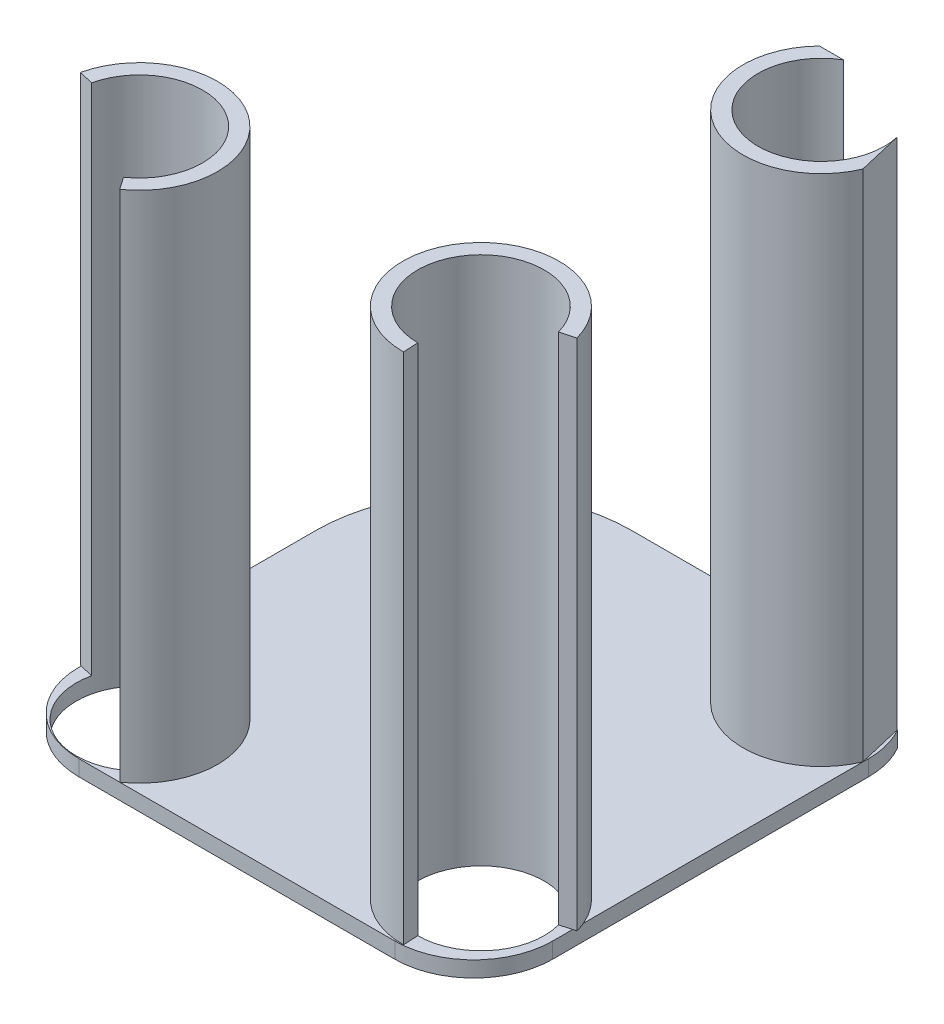
ISO-10303-21;
HEADER;
FILE_DESCRIPTION(('STEP AP214'),'2;1');
FILE_NAME('part.step','',(''),(''),'','','');
FILE_SCHEMA(('AUTOMOTIVE_DESIGN { 1 0 10303 214 1 1 1 1 }'));
ENDSEC;
DATA;
#1=APPLICATION_CONTEXT('core data for automotive mechanical design processes');
#2=APPLICATION_PROTOCOL_DEFINITION('international standard','automotive_design',2000,#1);
#3=PRODUCT_CONTEXT('',#1,'mechanical');
#4=PRODUCT('Part','Part','',(#3));
#5=PRODUCT_RELATED_PRODUCT_CATEGORY('part','',(#4));
#6=PRODUCT_DEFINITION_FORMATION('','',#4);
#7=PRODUCT_DEFINITION_CONTEXT('part definition',#1,'design');
#8=PRODUCT_DEFINITION('design','',#6,#7);
#9=PRODUCT_DEFINITION_SHAPE('','',#8);
#10=(LENGTH_UNIT() NAMED_UNIT(*) SI_UNIT(.MILLI.,.METRE.));
#11=(NAMED_UNIT(*) PLANE_ANGLE_UNIT() SI_UNIT($,.RADIAN.));
#12=(NAMED_UNIT(*) SI_UNIT($,.STERADIAN.) SOLID_ANGLE_UNIT());
#13=UNCERTAINTY_MEASURE_WITH_UNIT(LENGTH_MEASURE(1.E-05),#10,'distance_accuracy_value','');
#14=(GEOMETRIC_REPRESENTATION_CONTEXT(3) GLOBAL_UNCERTAINTY_ASSIGNED_CONTEXT((#13)) GLOBAL_UNIT_ASSIGNED_CONTEXT((#10,
#11,#12)) REPRESENTATION_CONTEXT('',''));
#15=CARTESIAN_POINT('',(0.,0.,0.));
#16=DIRECTION('',(0.,0.,1.));
#17=DIRECTION('',(1.,0.,0.));
#18=AXIS2_PLACEMENT_3D('',#15,#16,#17);
#19=CARTESIAN_POINT('',(-10.,2.,-10.));
#20=DIRECTION('',(0.,1.,0.));
#21=DIRECTION('',(0.,0.,1.));
#22=AXIS2_PLACEMENT_3D('',#19,#20,#21);
#23=PLANE('',#22);
#24=CARTESIAN_POINT('',(20.8756087929446,2.,-23.1122811636172));
#25=DIRECTION('',(0.,1.,0.));
#26=DIRECTION('',(0.,0.,1.));
#27=AXIS2_PLACEMENT_3D('',#24,#25,#26);
#28=CIRCLE('',#27,8.);
#29=CARTESIAN_POINT('',(28.6649005880078,2.,-24.9362694671325));
#30=VERTEX_POINT('',#29);
#31=CARTESIAN_POINT('',(28.6419805677825,2.,-25.0315178491257));
#32=VERTEX_POINT('',#31);
#33=EDGE_CURVE('E395',#30,#32,#28,.T.);
#34=ORIENTED_EDGE('',*,*,#33,.F.);
#35=DIRECTION('',(-0.227998537939416,0.,-0.973661474382903));
#36=VECTOR('',#35,1.);
#37=CARTESIAN_POINT('',(28.6649005880078,2.,-24.9362694671325));
#38=LINE('',#37,#36);
#39=CARTESIAN_POINT('',(29.9945445875876,2.,-19.2580614016966));
#40=VERTEX_POINT('',#39);
#41=EDGE_CURVE('E233',#40,#30,#38,.T.);
#42=ORIENTED_EDGE('',*,*,#41,.F.);
#43=CARTESIAN_POINT('',(20.8756087929446,2.,-23.1122811636172));
#44=DIRECTION('',(0.,1.,0.));
#45=DIRECTION('',(0.,0.,1.));
#46=AXIS2_PLACEMENT_3D('',#43,#44,#45);
#47=CIRCLE('',#46,9.90000000000001);
#48=CARTESIAN_POINT('',(13.7643972765476,2.,-30.));
#49=VERTEX_POINT('',#48);
#50=EDGE_CURVE('E228',#49,#40,#47,.T.);
#51=ORIENTED_EDGE('',*,*,#50,.F.);
#52=DIRECTION('',(-1.,0.,0.));
#53=VECTOR('',#52,1.);
#54=CARTESIAN_POINT('',(-9.99999999999986,2.,-30.));
#55=LINE('',#54,#53);
#56=CARTESIAN_POINT('',(-9.99999999999986,2.,-30.));
#57=VERTEX_POINT('',#56);
#58=EDGE_CURVE('E309',#49,#57,#55,.T.);
#59=ORIENTED_EDGE('',*,*,#58,.T.);
#60=CARTESIAN_POINT('',(-10.,2.,-10.));
#61=DIRECTION('',(0.,1.,0.));
#62=DIRECTION('',(0.,0.,1.));
#63=AXIS2_PLACEMENT_3D('',#60,#61,#62);
#64=CIRCLE('',#63,20.);
#65=CARTESIAN_POINT('',(-30.,2.,-9.99999999999986));
#66=VERTEX_POINT('',#65);
#67=EDGE_CURVE('E287',#57,#66,#64,.T.);
#68=ORIENTED_EDGE('',*,*,#67,.T.);
#69=DIRECTION('',(0.,0.,1.));
#70=VECTOR('',#69,1.);
#71=CARTESIAN_POINT('',(-30.,2.,-9.99999999999986));
#72=LINE('',#71,#70);
#73=CARTESIAN_POINT('',(-30.,2.,19.2191562591759));
#74=VERTEX_POINT('',#73);
#75=EDGE_CURVE('E292',#66,#74,#72,.T.);
#76=ORIENTED_EDGE('',*,*,#75,.T.);
#77=CARTESIAN_POINT('',(-20.4614102057831,2.,21.8696854021324));
#78=DIRECTION('',(0.,1.,0.));
#79=DIRECTION('',(0.,0.,1.));
#80=AXIS2_PLACEMENT_3D('',#77,#78,#79);
#81=CIRCLE('',#80,9.90000000000001);
#82=CARTESIAN_POINT('',(-14.8126949058497,2.,30.));
#83=VERTEX_POINT('',#82);
#84=EDGE_CURVE('E214',#83,#74,#81,.T.);
#85=ORIENTED_EDGE('',*,*,#84,.F.);
#86=DIRECTION('',(1.,0.,0.));
#87=VECTOR('',#86,1.);
#88=CARTESIAN_POINT('',(-19.9999999999999,2.,30.));
#89=LINE('',#88,#87);
#90=CARTESIAN_POINT('',(19.9999999999999,2.,30.));
#91=VERTEX_POINT('',#90);
#92=EDGE_CURVE('E296',#83,#91,#89,.T.);
#93=ORIENTED_EDGE('',*,*,#92,.T.);
#94=CARTESIAN_POINT('',(20.,2.,20.));
#95=DIRECTION('',(0.,1.,0.));
#96=DIRECTION('',(0.,0.,1.));
#97=AXIS2_PLACEMENT_3D('',#94,#95,#96);
#98=CIRCLE('',#97,10.);
#99=CARTESIAN_POINT('',(30.,2.,19.9999999999999));
#100=VERTEX_POINT('',#99);
#101=EDGE_CURVE('E299',#91,#100,#98,.T.);
#102=ORIENTED_EDGE('',*,*,#101,.T.);
#103=DIRECTION('',(0.,0.,-1.));
#104=VECTOR('',#103,1.);
#105=CARTESIAN_POINT('',(30.,2.,-19.9999999999999));
#106=LINE('',#105,#104);
#107=CARTESIAN_POINT('',(30.,2.,17.4849465873237));
#108=VERTEX_POINT('',#107);
#109=EDGE_CURVE('E302',#100,#108,#106,.T.);
#110=ORIENTED_EDGE('',*,*,#109,.T.);
#111=DIRECTION('',(0.965006242481765,0.,-0.262226909319437));
#112=VECTOR('',#111,1.);
#113=CARTESIAN_POINT('',(28.5956587327987,2.,17.8665566266337));
#114=LINE('',#113,#112);
#115=CARTESIAN_POINT('',(28.5956587327987,2.,17.8665566266337));
#116=VERTEX_POINT('',#115);
#117=EDGE_CURVE('E259',#116,#108,#114,.T.);
#118=ORIENTED_EDGE('',*,*,#117,.F.);
#119=CARTESIAN_POINT('',(20.8756087929446,2.,19.9643719011892));
#120=DIRECTION('',(0.,1.,0.));
#121=DIRECTION('',(0.,0.,1.));
#122=AXIS2_PLACEMENT_3D('',#119,#120,#121);
#123=CIRCLE('',#122,8.);
#124=CARTESIAN_POINT('',(20.8756087929446,2.,27.9643719011892));
#125=VERTEX_POINT('',#124);
#126=EDGE_CURVE('E404',#125,#116,#123,.T.);
#127=ORIENTED_EDGE('',*,*,#126,.F.);
#128=DIRECTION('',(-0.0533576659958689,0.,-0.998575465089882));
#129=VECTOR('',#128,1.);
#130=CARTESIAN_POINT('',(20.9771051819029,2.,29.8638516088824));
#131=LINE('',#130,#129);
#132=CARTESIAN_POINT('',(20.9771051819029,2.,29.8638516088824));
#133=VERTEX_POINT('',#132);
#134=EDGE_CURVE('E268',#133,#125,#131,.T.);
#135=ORIENTED_EDGE('',*,*,#134,.F.);
#136=CARTESIAN_POINT('',(20.8756087929446,2.,19.9643719011892));
#137=DIRECTION('',(0.,1.,0.));
#138=DIRECTION('',(0.,0.,1.));
#139=AXIS2_PLACEMENT_3D('',#136,#137,#138);
#140=CIRCLE('',#139,9.90000000000001);
#141=CARTESIAN_POINT('',(30.,2.,16.1230849943558));
#142=VERTEX_POINT('',#141);
#143=EDGE_CURVE('E269',#142,#133,#140,.T.);
#144=ORIENTED_EDGE('',*,*,#143,.F.);
#145=CARTESIAN_POINT('',(30.,2.,-19.9999999999999));
#146=VERTEX_POINT('',#145);
#147=EDGE_CURVE('E301',#142,#146,#106,.T.);
#148=ORIENTED_EDGE('',*,*,#147,.T.);
#149=CARTESIAN_POINT('',(20.,2.,-20.));
#150=DIRECTION('',(0.,1.,0.));
#151=DIRECTION('',(0.,0.,-1.));
#152=AXIS2_PLACEMENT_3D('',#149,#150,#151);
#153=CIRCLE('',#152,10.);
#154=EDGE_CURVE('E305',#146,#32,#153,.T.);
#155=ORIENTED_EDGE('',*,*,#154,.T.);
#156=EDGE_LOOP('',(#34,#42,#51,#59,#68,#76,#85,#93,#102,#110,#118,#127,#135,#144,#148,#155));
#157=FACE_BOUND('',#156,.T.);
#158=ADVANCED_FACE('F46',(#157),#23,.T.);
#159=CARTESIAN_POINT('',(-20.4614102057831,2.,21.8696854021324));
#160=DIRECTION('',(0.,1.,0.));
#161=DIRECTION('',(0.,0.,1.));
#162=AXIS2_PLACEMENT_3D('',#159,#160,#161);
#163=CIRCLE('',#162,8.);
#164=CARTESIAN_POINT('',(-28.2634255538148,2.,20.1009128025374));
#165=VERTEX_POINT('',#164);
#166=CARTESIAN_POINT('',(-15.8967917815945,2.,28.4396365923284));
#167=VERTEX_POINT('',#166);
#168=EDGE_CURVE('E61',#165,#167,#163,.T.);
#169=ORIENTED_EDGE('',*,*,#168,.F.);
#170=DIRECTION('',(0.975251918503959,0.,0.22109657494938));
#171=VECTOR('',#170,1.);
#172=CARTESIAN_POINT('',(-30.1164041989723,2.,19.6808293101336));
#173=LINE('',#172,#171);
#174=CARTESIAN_POINT('',(-30.,2.,19.7072189733726));
#175=VERTEX_POINT('',#174);
#176=EDGE_CURVE('E197',#175,#165,#173,.T.);
#177=ORIENTED_EDGE('',*,*,#176,.F.);
#178=CARTESIAN_POINT('',(-30.,2.,19.9999999999999));
#179=VERTEX_POINT('',#178);
#180=EDGE_CURVE('E290',#175,#179,#72,.T.);
#181=ORIENTED_EDGE('',*,*,#180,.T.);
#182=CARTESIAN_POINT('',(-20.,2.,20.));
#183=DIRECTION('',(0.,1.,0.));
#184=DIRECTION('',(0.,0.,1.));
#185=AXIS2_PLACEMENT_3D('',#182,#183,#184);
#186=CIRCLE('',#185,10.);
#187=CARTESIAN_POINT('',(-19.9999999999999,2.,30.));
#188=VERTEX_POINT('',#187);
#189=EDGE_CURVE('E294',#179,#188,#186,.T.);
#190=ORIENTED_EDGE('',*,*,#189,.T.);
#191=EDGE_CURVE('E297',#188,#83,#89,.T.);
#192=ORIENTED_EDGE('',*,*,#191,.T.);
#193=DIRECTION('',(0.570577303023579,0.,0.821243898774499));
#194=VECTOR('',#193,1.);
#195=CARTESIAN_POINT('',(-14.8126949058497,2.,30.));
#196=LINE('',#195,#194);
#197=EDGE_CURVE('E200',#167,#83,#196,.T.);
#198=ORIENTED_EDGE('',*,*,#197,.F.);
#199=EDGE_LOOP('',(#169,#177,#181,#190,#192,#198));
#200=FACE_BOUND('',#199,.T.);
#201=ADVANCED_FACE('F196',(#200),#23,.T.);
#202=CARTESIAN_POINT('',(-10.,2.,-10.));
#203=DIRECTION('',(0.,-1.,0.));
#204=DIRECTION('',(0.,0.,-1.));
#205=AXIS2_PLACEMENT_3D('',#202,#203,#204);
#206=CYLINDRICAL_SURFACE('',#205,20.);
#207=CARTESIAN_POINT('',(-10.,0.,-10.));
#208=DIRECTION('',(0.,1.,0.));
#209=DIRECTION('',(0.,0.,1.));
#210=AXIS2_PLACEMENT_3D('',#207,#208,#209);
#211=CIRCLE('',#210,20.);
#212=CARTESIAN_POINT('',(-9.99999999999986,0.,-30.));
#213=VERTEX_POINT('',#212);
#214=CARTESIAN_POINT('',(-30.,0.,-9.99999999999986));
#215=VERTEX_POINT('',#214);
#216=EDGE_CURVE('E286',#213,#215,#211,.T.);
#217=ORIENTED_EDGE('',*,*,#216,.T.);
#218=DIRECTION('',(0.,-1.,0.));
#219=VECTOR('',#218,1.);
#220=CARTESIAN_POINT('',(-30.,2.,-9.99999999999986));
#221=LINE('',#220,#219);
#222=EDGE_CURVE('E345',#66,#215,#221,.T.);
#223=ORIENTED_EDGE('',*,*,#222,.F.);
#224=ORIENTED_EDGE('',*,*,#67,.F.);
#225=DIRECTION('',(0.,-1.,0.));
#226=VECTOR('',#225,1.);
#227=CARTESIAN_POINT('',(-9.99999999999986,2.,-30.));
#228=LINE('',#227,#226);
#229=EDGE_CURVE('E311',#57,#213,#228,.T.);
#230=ORIENTED_EDGE('',*,*,#229,.T.);
#231=EDGE_LOOP('',(#217,#223,#224,#230));
#232=FACE_BOUND('',#231,.T.);
#233=ADVANCED_FACE('F48',(#232),#206,.T.);
#234=CARTESIAN_POINT('',(-30.,2.,-9.99999999999986));
#235=DIRECTION('',(1.,0.,0.));
#236=DIRECTION('',(0.,0.,-1.));
#237=AXIS2_PLACEMENT_3D('',#234,#235,#236);
#238=PLANE('',#237);
#239=DIRECTION('',(0.,0.,1.));
#240=VECTOR('',#239,1.);
#241=CARTESIAN_POINT('',(-30.,0.,-9.99999999999986));
#242=LINE('',#241,#240);
#243=CARTESIAN_POINT('',(-30.,0.,19.9999999999999));
#244=VERTEX_POINT('',#243);
#245=EDGE_CURVE('E314',#215,#244,#242,.T.);
#246=ORIENTED_EDGE('',*,*,#245,.T.);
#247=DIRECTION('',(0.,-1.,0.));
#248=VECTOR('',#247,1.);
#249=CARTESIAN_POINT('',(-30.,2.,19.9999999999999));
#250=LINE('',#249,#248);
#251=EDGE_CURVE('E342',#179,#244,#250,.T.);
#252=ORIENTED_EDGE('',*,*,#251,.F.);
#253=ORIENTED_EDGE('',*,*,#180,.F.);
#254=DIRECTION('',(0.,0.,1.));
#255=VECTOR('',#254,1.);
#256=CARTESIAN_POINT('',(-30.,2.,-9.99999999999986));
#257=LINE('',#256,#255);
#258=EDGE_CURVE('E69',#74,#175,#257,.T.);
#259=ORIENTED_EDGE('',*,*,#258,.F.);
#260=ORIENTED_EDGE('',*,*,#75,.F.);
#261=ORIENTED_EDGE('',*,*,#222,.T.);
#262=EDGE_LOOP('',(#246,#252,#253,#259,#260,#261));
#263=FACE_BOUND('',#262,.T.);
#264=ADVANCED_FACE('F466',(#263),#238,.F.);
#265=CARTESIAN_POINT('',(-20.,2.,20.));
#266=DIRECTION('',(0.,-1.,0.));
#267=DIRECTION('',(0.,0.,-1.));
#268=AXIS2_PLACEMENT_3D('',#265,#266,#267);
#269=CYLINDRICAL_SURFACE('',#268,10.);
#270=CARTESIAN_POINT('',(-20.,0.,20.));
#271=DIRECTION('',(0.,1.,0.));
#272=DIRECTION('',(0.,0.,1.));
#273=AXIS2_PLACEMENT_3D('',#270,#271,#272);
#274=CIRCLE('',#273,10.);
#275=CARTESIAN_POINT('',(-19.9999999999999,0.,30.));
#276=VERTEX_POINT('',#275);
#277=EDGE_CURVE('E316',#244,#276,#274,.T.);
#278=ORIENTED_EDGE('',*,*,#277,.T.);
#279=DIRECTION('',(0.,-1.,0.));
#280=VECTOR('',#279,1.);
#281=CARTESIAN_POINT('',(-19.9999999999999,2.,30.));
#282=LINE('',#281,#280);
#283=EDGE_CURVE('E339',#188,#276,#282,.T.);
#284=ORIENTED_EDGE('',*,*,#283,.F.);
#285=ORIENTED_EDGE('',*,*,#189,.F.);
#286=ORIENTED_EDGE('',*,*,#251,.T.);
#287=EDGE_LOOP('',(#278,#284,#285,#286));
#288=FACE_BOUND('',#287,.T.);
#289=ADVANCED_FACE('F463',(#288),#269,.T.);
#290=CARTESIAN_POINT('',(-19.9999999999999,2.,30.));
#291=DIRECTION('',(0.,0.,-1.));
#292=DIRECTION('',(-1.,0.,0.));
#293=AXIS2_PLACEMENT_3D('',#290,#291,#292);
#294=PLANE('',#293);
#295=DIRECTION('',(1.,0.,0.));
#296=VECTOR('',#295,1.);
#297=CARTESIAN_POINT('',(-19.9999999999999,0.,30.));
#298=LINE('',#297,#296);
#299=CARTESIAN_POINT('',(19.9999999999999,0.,30.));
#300=VERTEX_POINT('',#299);
#301=EDGE_CURVE('E318',#276,#300,#298,.T.);
#302=ORIENTED_EDGE('',*,*,#301,.T.);
#303=DIRECTION('',(0.,-1.,0.));
#304=VECTOR('',#303,1.);
#305=CARTESIAN_POINT('',(19.9999999999999,2.,30.));
#306=LINE('',#305,#304);
#307=EDGE_CURVE('E336',#91,#300,#306,.T.);
#308=ORIENTED_EDGE('',*,*,#307,.F.);
#309=ORIENTED_EDGE('',*,*,#92,.F.);
#310=ORIENTED_EDGE('',*,*,#191,.F.);
#311=ORIENTED_EDGE('',*,*,#283,.T.);
#312=EDGE_LOOP('',(#302,#308,#309,#310,#311));
#313=FACE_BOUND('',#312,.T.);
#314=ADVANCED_FACE('F459',(#313),#294,.F.);
#315=CARTESIAN_POINT('',(20.,2.,20.));
#316=DIRECTION('',(0.,-1.,0.));
#317=DIRECTION('',(0.,0.,-1.));
#318=AXIS2_PLACEMENT_3D('',#315,#316,#317);
#319=CYLINDRICAL_SURFACE('',#318,10.);
#320=CARTESIAN_POINT('',(20.,0.,20.));
#321=DIRECTION('',(0.,1.,0.));
#322=DIRECTION('',(0.,0.,1.));
#323=AXIS2_PLACEMENT_3D('',#320,#321,#322);
#324=CIRCLE('',#323,10.);
#325=CARTESIAN_POINT('',(30.,0.,19.9999999999999));
#326=VERTEX_POINT('',#325);
#327=EDGE_CURVE('E320',#300,#326,#324,.T.);
#328=ORIENTED_EDGE('',*,*,#327,.T.);
#329=DIRECTION('',(0.,-1.,0.));
#330=VECTOR('',#329,1.);
#331=CARTESIAN_POINT('',(30.,2.,19.9999999999999));
#332=LINE('',#331,#330);
#333=EDGE_CURVE('E333',#100,#326,#332,.T.);
#334=ORIENTED_EDGE('',*,*,#333,.F.);
#335=ORIENTED_EDGE('',*,*,#101,.F.);
#336=ORIENTED_EDGE('',*,*,#307,.T.);
#337=EDGE_LOOP('',(#328,#334,#335,#336));
#338=FACE_BOUND('',#337,.T.);
#339=ADVANCED_FACE('F455',(#338),#319,.T.);
#340=CARTESIAN_POINT('',(30.,2.,-19.9999999999999));
#341=DIRECTION('',(-1.,0.,0.));
#342=DIRECTION('',(0.,0.,1.));
#343=AXIS2_PLACEMENT_3D('',#340,#341,#342);
#344=PLANE('',#343);
#345=DIRECTION('',(0.,0.,-1.));
#346=VECTOR('',#345,1.);
#347=CARTESIAN_POINT('',(30.,0.,-19.9999999999999));
#348=LINE('',#347,#346);
#349=CARTESIAN_POINT('',(30.,0.,-19.9999999999999));
#350=VERTEX_POINT('',#349);
#351=EDGE_CURVE('E322',#326,#350,#348,.T.);
#352=ORIENTED_EDGE('',*,*,#351,.T.);
#353=DIRECTION('',(0.,-1.,0.));
#354=VECTOR('',#353,1.);
#355=CARTESIAN_POINT('',(30.,2.,-19.9999999999999));
#356=LINE('',#355,#354);
#357=EDGE_CURVE('E330',#146,#350,#356,.T.);
#358=ORIENTED_EDGE('',*,*,#357,.F.);
#359=ORIENTED_EDGE('',*,*,#147,.F.);
#360=EDGE_CURVE('E306',#108,#142,#106,.T.);
#361=ORIENTED_EDGE('',*,*,#360,.F.);
#362=ORIENTED_EDGE('',*,*,#109,.F.);
#363=ORIENTED_EDGE('',*,*,#333,.T.);
#364=EDGE_LOOP('',(#352,#358,#359,#361,#362,#363));
#365=FACE_BOUND('',#364,.T.);
#366=ADVANCED_FACE('F452',(#365),#344,.F.);
#367=CARTESIAN_POINT('',(20.,2.,-20.));
#368=DIRECTION('',(0.,-1.,0.));
#369=DIRECTION('',(0.,0.,-1.));
#370=AXIS2_PLACEMENT_3D('',#367,#368,#369);
#371=CYLINDRICAL_SURFACE('',#370,10.);
#372=CARTESIAN_POINT('',(20.,0.,-20.));
#373=DIRECTION('',(0.,1.,0.));
#374=DIRECTION('',(0.,0.,-1.));
#375=AXIS2_PLACEMENT_3D('',#372,#373,#374);
#376=CIRCLE('',#375,10.);
#377=CARTESIAN_POINT('',(28.6419805677825,0.,-25.0315178491257));
#378=VERTEX_POINT('',#377);
#379=EDGE_CURVE('E324',#350,#378,#376,.T.);
#380=ORIENTED_EDGE('',*,*,#379,.T.);
#381=DIRECTION('',(0.,1.,0.));
#382=VECTOR('',#381,1.);
#383=CARTESIAN_POINT('',(28.6419805677825,1.,-25.0315178491257));
#384=LINE('',#383,#382);
#385=EDGE_CURVE('E394',#378,#32,#384,.T.);
#386=ORIENTED_EDGE('',*,*,#385,.T.);
#387=ORIENTED_EDGE('',*,*,#154,.F.);
#388=ORIENTED_EDGE('',*,*,#357,.T.);
#389=EDGE_LOOP('',(#380,#386,#387,#388));
#390=FACE_BOUND('',#389,.T.);
#391=ADVANCED_FACE('F449',(#390),#371,.T.);
#392=CARTESIAN_POINT('',(-9.99999999999986,2.,-30.));
#393=DIRECTION('',(0.,0.,1.));
#394=DIRECTION('',(1.,0.,0.));
#395=AXIS2_PLACEMENT_3D('',#392,#393,#394);
#396=PLANE('',#395);
#397=DIRECTION('',(0.,-1.,0.));
#398=VECTOR('',#397,1.);
#399=CARTESIAN_POINT('',(16.8062932201563,67.,-30.));
#400=LINE('',#399,#398);
#401=CARTESIAN_POINT('',(16.8062932201563,67.,-30.));
#402=VERTEX_POINT('',#401);
#403=CARTESIAN_POINT('',(16.8062932201563,0.,-30.));
#404=VERTEX_POINT('',#403);
#405=EDGE_CURVE('E246',#402,#404,#400,.T.);
#406=ORIENTED_EDGE('',*,*,#405,.T.);
#407=DIRECTION('',(-1.,0.,0.));
#408=VECTOR('',#407,1.);
#409=CARTESIAN_POINT('',(-9.99999999999986,0.,-30.));
#410=LINE('',#409,#408);
#411=EDGE_CURVE('E291',#404,#213,#410,.T.);
#412=ORIENTED_EDGE('',*,*,#411,.T.);
#413=ORIENTED_EDGE('',*,*,#229,.F.);
#414=ORIENTED_EDGE('',*,*,#58,.F.);
#415=DIRECTION('',(0.,-1.,0.));
#416=VECTOR('',#415,1.);
#417=CARTESIAN_POINT('',(13.7643972765476,67.,-30.));
#418=LINE('',#417,#416);
#419=CARTESIAN_POINT('',(13.7643972765476,67.,-30.));
#420=VERTEX_POINT('',#419);
#421=EDGE_CURVE('E239',#420,#49,#418,.T.);
#422=ORIENTED_EDGE('',*,*,#421,.F.);
#423=DIRECTION('',(-1.,0.,0.));
#424=VECTOR('',#423,1.);
#425=CARTESIAN_POINT('',(13.7643972765476,67.,-30.));
#426=LINE('',#425,#424);
#427=EDGE_CURVE('E237',#402,#420,#426,.T.);
#428=ORIENTED_EDGE('',*,*,#427,.F.);
#429=EDGE_LOOP('',(#406,#412,#413,#414,#422,#428));
#430=FACE_BOUND('',#429,.T.);
#431=ADVANCED_FACE('F359',(#430),#396,.F.);
#432=CARTESIAN_POINT('',(-10.,0.,-10.));
#433=DIRECTION('',(0.,1.,0.));
#434=DIRECTION('',(0.,0.,1.));
#435=AXIS2_PLACEMENT_3D('',#432,#433,#434);
#436=PLANE('',#435);
#437=CARTESIAN_POINT('',(-5.40151955000212,0.,9.12093029177186));
#438=DIRECTION('',(0.,1.,0.));
#439=DIRECTION('',(0.,0.,1.));
#440=AXIS2_PLACEMENT_3D('',#437,#438,#439);
#441=CIRCLE('',#440,2.);
#442=CARTESIAN_POINT('',(-5.40151955000212,0.,11.1209302917719));
#443=VERTEX_POINT('',#442);
#444=EDGE_CURVE('E13',#443,#443,#441,.F.);
#445=ORIENTED_EDGE('',*,*,#444,.F.);
#446=EDGE_LOOP('',(#445));
#447=FACE_BOUND('',#446,.T.);
#448=CARTESIAN_POINT('',(6.60021365303765,0.,-6.06785406469168));
#449=DIRECTION('',(0.,1.,0.));
#450=DIRECTION('',(0.,0.,1.));
#451=AXIS2_PLACEMENT_3D('',#448,#449,#450);
#452=CIRCLE('',#451,2.);
#453=CARTESIAN_POINT('',(6.60021365303765,0.,-4.06785406469168));
#454=VERTEX_POINT('',#453);
#455=EDGE_CURVE('E54',#454,#454,#452,.F.);
#456=ORIENTED_EDGE('',*,*,#455,.F.);
#457=EDGE_LOOP('',(#456));
#458=FACE_BOUND('',#457,.T.);
#459=CARTESIAN_POINT('',(-20.4614102057831,0.,21.8696854021324));
#460=DIRECTION('',(0.,1.,0.));
#461=DIRECTION('',(0.,0.,1.));
#462=AXIS2_PLACEMENT_3D('',#459,#460,#461);
#463=CIRCLE('',#462,8.);
#464=CARTESIAN_POINT('',(-20.4614102057831,0.,29.8696854021324));
#465=VERTEX_POINT('',#464);
#466=EDGE_CURVE('E202',#465,#465,#463,.T.);
#467=ORIENTED_EDGE('',*,*,#466,.T.);
#468=EDGE_LOOP('',(#467));
#469=FACE_BOUND('',#468,.T.);
#470=CARTESIAN_POINT('',(20.8756087929446,0.,19.9643719011892));
#471=DIRECTION('',(0.,1.,0.));
#472=DIRECTION('',(0.,0.,1.));
#473=AXIS2_PLACEMENT_3D('',#470,#471,#472);
#474=CIRCLE('',#473,8.);
#475=CARTESIAN_POINT('',(20.8756087929446,0.,27.9643719011892));
#476=VERTEX_POINT('',#475);
#477=EDGE_CURVE('E203',#476,#476,#474,.T.);
#478=ORIENTED_EDGE('',*,*,#477,.T.);
#479=EDGE_LOOP('',(#478));
#480=FACE_BOUND('',#479,.T.);
#481=ORIENTED_EDGE('',*,*,#411,.F.);
#482=CARTESIAN_POINT('',(20.8756087929446,0.,-23.1122811636172));
#483=DIRECTION('',(0.,1.,0.));
#484=DIRECTION('',(0.,0.,1.));
#485=AXIS2_PLACEMENT_3D('',#482,#483,#484);
#486=CIRCLE('',#485,8.);
#487=EDGE_CURVE('E348',#404,#378,#486,.T.);
#488=ORIENTED_EDGE('',*,*,#487,.T.);
#489=ORIENTED_EDGE('',*,*,#379,.F.);
#490=ORIENTED_EDGE('',*,*,#351,.F.);
#491=ORIENTED_EDGE('',*,*,#327,.F.);
#492=ORIENTED_EDGE('',*,*,#301,.F.);
#493=ORIENTED_EDGE('',*,*,#277,.F.);
#494=ORIENTED_EDGE('',*,*,#245,.F.);
#495=ORIENTED_EDGE('',*,*,#216,.F.);
#496=EDGE_LOOP('',(#481,#488,#489,#490,#491,#492,#493,#494,#495));
#497=FACE_BOUND('',#496,.T.);
#498=ADVANCED_FACE('F355',(#447,#458,#469,#480,#497),#436,.F.);
#499=CARTESIAN_POINT('',(20.8756087929446,2.,19.9643719011892));
#500=DIRECTION('',(0.,1.,0.));
#501=DIRECTION('',(0.,0.,1.));
#502=AXIS2_PLACEMENT_3D('',#499,#500,#501);
#503=PLANE('',#502);
#504=CARTESIAN_POINT('',(30.4291705935141,2.,17.3683254989268));
#505=VERTEX_POINT('',#504);
#506=EDGE_CURVE('E272',#108,#505,#114,.T.);
#507=ORIENTED_EDGE('',*,*,#506,.F.);
#508=ORIENTED_EDGE('',*,*,#360,.T.);
#509=EDGE_CURVE('E254',#505,#142,#140,.T.);
#510=ORIENTED_EDGE('',*,*,#509,.F.);
#511=EDGE_LOOP('',(#507,#508,#510));
#512=FACE_BOUND('',#511,.T.);
#513=ADVANCED_FACE('F358',(#512),#503,.F.);
#514=CARTESIAN_POINT('',(20.8756087929446,67.,19.9643719011892));
#515=DIRECTION('',(0.,-1.,0.));
#516=DIRECTION('',(0.,0.,-1.));
#517=AXIS2_PLACEMENT_3D('',#514,#515,#516);
#518=CYLINDRICAL_SURFACE('',#517,9.90000000000001);
#519=ORIENTED_EDGE('',*,*,#509,.T.);
#520=ORIENTED_EDGE('',*,*,#143,.T.);
#521=DIRECTION('',(0.,-1.,0.));
#522=VECTOR('',#521,1.);
#523=CARTESIAN_POINT('',(20.9771051819029,67.,29.8638516088824));
#524=LINE('',#523,#522);
#525=CARTESIAN_POINT('',(20.9771051819029,67.,29.8638516088824));
#526=VERTEX_POINT('',#525);
#527=EDGE_CURVE('E283',#526,#133,#524,.T.);
#528=ORIENTED_EDGE('',*,*,#527,.F.);
#529=CARTESIAN_POINT('',(20.8756087929446,67.,19.9643719011892));
#530=DIRECTION('',(0.,1.,0.));
#531=DIRECTION('',(0.,0.,1.));
#532=AXIS2_PLACEMENT_3D('',#529,#530,#531);
#533=CIRCLE('',#532,9.90000000000001);
#534=CARTESIAN_POINT('',(30.4291705935141,67.,17.3683254989268));
#535=VERTEX_POINT('',#534);
#536=EDGE_CURVE('E255',#535,#526,#533,.T.);
#537=ORIENTED_EDGE('',*,*,#536,.F.);
#538=DIRECTION('',(0.,-1.,0.));
#539=VECTOR('',#538,1.);
#540=CARTESIAN_POINT('',(30.4291705935141,67.,17.3683254989268));
#541=LINE('',#540,#539);
#542=EDGE_CURVE('E265',#535,#505,#541,.T.);
#543=ORIENTED_EDGE('',*,*,#542,.T.);
#544=EDGE_LOOP('',(#519,#520,#528,#537,#543));
#545=FACE_BOUND('',#544,.T.);
#546=ADVANCED_FACE('F444',(#545),#518,.T.);
#547=CARTESIAN_POINT('',(20.9771051819029,67.,29.8638516088824));
#548=DIRECTION('',(-0.998575465089881,0.,0.0533576659958689));
#549=DIRECTION('',(0.0533576659958689,0.,0.998575465089882));
#550=AXIS2_PLACEMENT_3D('',#547,#548,#549);
#551=PLANE('',#550);
#552=ORIENTED_EDGE('',*,*,#134,.T.);
#553=DIRECTION('',(0.,-1.,0.));
#554=VECTOR('',#553,1.);
#555=CARTESIAN_POINT('',(20.8756087929446,67.,27.9643719011892));
#556=LINE('',#555,#554);
#557=CARTESIAN_POINT('',(20.8756087929446,67.,27.9643719011892));
#558=VERTEX_POINT('',#557);
#559=EDGE_CURVE('E280',#558,#125,#556,.T.);
#560=ORIENTED_EDGE('',*,*,#559,.F.);
#561=DIRECTION('',(-0.0533576659958689,0.,-0.998575465089882));
#562=VECTOR('',#561,1.);
#563=CARTESIAN_POINT('',(20.9771051819029,67.,29.8638516088824));
#564=LINE('',#563,#562);
#565=EDGE_CURVE('E258',#526,#558,#564,.T.);
#566=ORIENTED_EDGE('',*,*,#565,.F.);
#567=ORIENTED_EDGE('',*,*,#527,.T.);
#568=EDGE_LOOP('',(#552,#560,#566,#567));
#569=FACE_BOUND('',#568,.T.);
#570=ADVANCED_FACE('F556',(#569),#551,.F.);
#571=CARTESIAN_POINT('',(20.8756087929446,67.,19.9643719011892));
#572=DIRECTION('',(0.,-1.,0.));
#573=DIRECTION('',(0.,0.,-1.));
#574=AXIS2_PLACEMENT_3D('',#571,#572,#573);
#575=CYLINDRICAL_SURFACE('',#574,8.);
#576=ORIENTED_EDGE('',*,*,#559,.T.);
#577=ORIENTED_EDGE('',*,*,#126,.T.);
#578=DIRECTION('',(0.,-1.,0.));
#579=VECTOR('',#578,1.);
#580=CARTESIAN_POINT('',(28.5956587327987,67.,17.8665566266337));
#581=LINE('',#580,#579);
#582=CARTESIAN_POINT('',(28.5956587327987,67.,17.8665566266337));
#583=VERTEX_POINT('',#582);
#584=EDGE_CURVE('E277',#583,#116,#581,.T.);
#585=ORIENTED_EDGE('',*,*,#584,.F.);
#586=CARTESIAN_POINT('',(20.8756087929446,67.,19.9643719011892));
#587=DIRECTION('',(0.,-1.,0.));
#588=DIRECTION('',(0.,0.,1.));
#589=AXIS2_PLACEMENT_3D('',#586,#587,#588);
#590=CIRCLE('',#589,8.);
#591=EDGE_CURVE('E261',#558,#583,#590,.T.);
#592=ORIENTED_EDGE('',*,*,#591,.F.);
#593=EDGE_LOOP('',(#576,#577,#585,#592));
#594=FACE_BOUND('',#593,.T.);
#595=ORIENTED_EDGE('',*,*,#477,.F.);
#596=EDGE_LOOP('',(#595));
#597=FACE_BOUND('',#596,.T.);
#598=ADVANCED_FACE('F497',(#594,#597),#575,.F.);
#599=CARTESIAN_POINT('',(28.5956587327987,67.,17.8665566266337));
#600=DIRECTION('',(-0.262226909319437,0.,-0.965006242481765));
#601=DIRECTION('',(-0.965006242481765,0.,0.262226909319437));
#602=AXIS2_PLACEMENT_3D('',#599,#600,#601);
#603=PLANE('',#602);
#604=ORIENTED_EDGE('',*,*,#117,.T.);
#605=ORIENTED_EDGE('',*,*,#506,.T.);
#606=ORIENTED_EDGE('',*,*,#542,.F.);
#607=DIRECTION('',(0.965006242481765,0.,-0.262226909319437));
#608=VECTOR('',#607,1.);
#609=CARTESIAN_POINT('',(28.5956587327987,67.,17.8665566266337));
#610=LINE('',#609,#608);
#611=EDGE_CURVE('E263',#583,#535,#610,.T.);
#612=ORIENTED_EDGE('',*,*,#611,.F.);
#613=ORIENTED_EDGE('',*,*,#584,.T.);
#614=EDGE_LOOP('',(#604,#605,#606,#612,#613));
#615=FACE_BOUND('',#614,.T.);
#616=ADVANCED_FACE('F492',(#615),#603,.F.);
#617=CARTESIAN_POINT('',(20.8756087929446,67.,19.9643719011892));
#618=DIRECTION('',(0.,1.,0.));
#619=DIRECTION('',(0.,0.,1.));
#620=AXIS2_PLACEMENT_3D('',#617,#618,#619);
#621=PLANE('',#620);
#622=ORIENTED_EDGE('',*,*,#536,.T.);
#623=ORIENTED_EDGE('',*,*,#565,.T.);
#624=ORIENTED_EDGE('',*,*,#591,.T.);
#625=ORIENTED_EDGE('',*,*,#611,.T.);
#626=EDGE_LOOP('',(#622,#623,#624,#625));
#627=FACE_BOUND('',#626,.T.);
#628=ADVANCED_FACE('F547',(#627),#621,.T.);
#629=CARTESIAN_POINT('',(20.8756087929446,67.,-23.1122811636172));
#630=DIRECTION('',(0.,-1.,0.));
#631=DIRECTION('',(0.,0.,-1.));
#632=AXIS2_PLACEMENT_3D('',#629,#630,#631);
#633=CYLINDRICAL_SURFACE('',#632,9.90000000000001);
#634=ORIENTED_EDGE('',*,*,#50,.T.);
#635=DIRECTION('',(0.,-1.,0.));
#636=VECTOR('',#635,1.);
#637=CARTESIAN_POINT('',(29.9945445875876,67.,-19.2580614016966));
#638=LINE('',#637,#636);
#639=CARTESIAN_POINT('',(29.9945445875876,67.,-19.2580614016966));
#640=VERTEX_POINT('',#639);
#641=EDGE_CURVE('E251',#640,#40,#638,.T.);
#642=ORIENTED_EDGE('',*,*,#641,.F.);
#643=CARTESIAN_POINT('',(20.8756087929446,67.,-23.1122811636172));
#644=DIRECTION('',(0.,1.,0.));
#645=DIRECTION('',(0.,0.,1.));
#646=AXIS2_PLACEMENT_3D('',#643,#644,#645);
#647=CIRCLE('',#646,9.90000000000001);
#648=EDGE_CURVE('E229',#420,#640,#647,.T.);
#649=ORIENTED_EDGE('',*,*,#648,.F.);
#650=ORIENTED_EDGE('',*,*,#421,.T.);
#651=EDGE_LOOP('',(#634,#642,#649,#650));
#652=FACE_BOUND('',#651,.T.);
#653=ADVANCED_FACE('F386',(#652),#633,.T.);
#654=CARTESIAN_POINT('',(28.6649005880078,67.,-24.9362694671325));
#655=DIRECTION('',(-0.973661474382903,0.,0.227998537939416));
#656=DIRECTION('',(0.227998537939416,0.,0.973661474382903));
#657=AXIS2_PLACEMENT_3D('',#654,#655,#656);
#658=PLANE('',#657);
#659=ORIENTED_EDGE('',*,*,#41,.T.);
#660=DIRECTION('',(0.,-1.,0.));
#661=VECTOR('',#660,1.);
#662=CARTESIAN_POINT('',(28.6649005880078,67.,-24.9362694671325));
#663=LINE('',#662,#661);
#664=CARTESIAN_POINT('',(28.6649005880078,67.,-24.9362694671325));
#665=VERTEX_POINT('',#664);
#666=EDGE_CURVE('E248',#665,#30,#663,.T.);
#667=ORIENTED_EDGE('',*,*,#666,.F.);
#668=DIRECTION('',(-0.227998537939416,0.,-0.973661474382903));
#669=VECTOR('',#668,1.);
#670=CARTESIAN_POINT('',(28.6649005880078,67.,-24.9362694671325));
#671=LINE('',#670,#669);
#672=EDGE_CURVE('E232',#640,#665,#671,.T.);
#673=ORIENTED_EDGE('',*,*,#672,.F.);
#674=ORIENTED_EDGE('',*,*,#641,.T.);
#675=EDGE_LOOP('',(#659,#667,#673,#674));
#676=FACE_BOUND('',#675,.T.);
#677=ADVANCED_FACE('F541',(#676),#658,.F.);
#678=CARTESIAN_POINT('',(20.8756087929446,67.,-23.1122811636172));
#679=DIRECTION('',(0.,-1.,0.));
#680=DIRECTION('',(0.,0.,-1.));
#681=AXIS2_PLACEMENT_3D('',#678,#679,#680);
#682=CYLINDRICAL_SURFACE('',#681,8.);
#683=ORIENTED_EDGE('',*,*,#666,.T.);
#684=ORIENTED_EDGE('',*,*,#33,.T.);
#685=ORIENTED_EDGE('',*,*,#385,.F.);
#686=ORIENTED_EDGE('',*,*,#487,.F.);
#687=ORIENTED_EDGE('',*,*,#405,.F.);
#688=CARTESIAN_POINT('',(20.8756087929446,67.,-23.1122811636172));
#689=DIRECTION('',(0.,-1.,0.));
#690=DIRECTION('',(0.,0.,1.));
#691=AXIS2_PLACEMENT_3D('',#688,#689,#690);
#692=CIRCLE('',#691,8.);
#693=EDGE_CURVE('E235',#665,#402,#692,.T.);
#694=ORIENTED_EDGE('',*,*,#693,.F.);
#695=EDGE_LOOP('',(#683,#684,#685,#686,#687,#694));
#696=FACE_BOUND('',#695,.T.);
#697=ADVANCED_FACE('F392',(#696),#682,.F.);
#698=CARTESIAN_POINT('',(20.8756087929446,67.,-23.1122811636172));
#699=DIRECTION('',(0.,1.,0.));
#700=DIRECTION('',(0.,0.,1.));
#701=AXIS2_PLACEMENT_3D('',#698,#699,#700);
#702=PLANE('',#701);
#703=ORIENTED_EDGE('',*,*,#648,.T.);
#704=ORIENTED_EDGE('',*,*,#672,.T.);
#705=ORIENTED_EDGE('',*,*,#693,.T.);
#706=ORIENTED_EDGE('',*,*,#427,.T.);
#707=EDGE_LOOP('',(#703,#704,#705,#706));
#708=FACE_BOUND('',#707,.T.);
#709=ADVANCED_FACE('F388',(#708),#702,.T.);
#710=CARTESIAN_POINT('',(-20.4614102057831,2.,21.8696854021324));
#711=DIRECTION('',(0.,1.,0.));
#712=DIRECTION('',(0.,0.,1.));
#713=AXIS2_PLACEMENT_3D('',#710,#711,#712);
#714=PLANE('',#713);
#715=CARTESIAN_POINT('',(-30.1164041989723,2.,19.6808293101336));
#716=VERTEX_POINT('',#715);
#717=EDGE_CURVE('E398',#74,#716,#81,.T.);
#718=ORIENTED_EDGE('',*,*,#717,.F.);
#719=ORIENTED_EDGE('',*,*,#258,.T.);
#720=EDGE_CURVE('E213',#716,#175,#173,.T.);
#721=ORIENTED_EDGE('',*,*,#720,.F.);
#722=EDGE_LOOP('',(#718,#719,#721));
#723=FACE_BOUND('',#722,.T.);
#724=ADVANCED_FACE('F427',(#723),#714,.F.);
#725=CARTESIAN_POINT('',(-20.4614102057831,67.,21.8696854021324));
#726=DIRECTION('',(0.,-1.,0.));
#727=DIRECTION('',(0.,0.,-1.));
#728=AXIS2_PLACEMENT_3D('',#725,#726,#727);
#729=CYLINDRICAL_SURFACE('',#728,9.90000000000001);
#730=ORIENTED_EDGE('',*,*,#84,.T.);
#731=ORIENTED_EDGE('',*,*,#717,.T.);
#732=DIRECTION('',(0.,-1.,0.));
#733=VECTOR('',#732,1.);
#734=CARTESIAN_POINT('',(-30.1164041989723,67.,19.6808293101336));
#735=LINE('',#734,#733);
#736=CARTESIAN_POINT('',(-30.1164041989723,67.,19.6808293101336));
#737=VERTEX_POINT('',#736);
#738=EDGE_CURVE('E219',#737,#716,#735,.T.);
#739=ORIENTED_EDGE('',*,*,#738,.F.);
#740=CARTESIAN_POINT('',(-20.4614102057831,67.,21.8696854021324));
#741=DIRECTION('',(0.,1.,0.));
#742=DIRECTION('',(0.,0.,1.));
#743=AXIS2_PLACEMENT_3D('',#740,#741,#742);
#744=CIRCLE('',#743,9.90000000000001);
#745=CARTESIAN_POINT('',(-14.8126949058497,67.,30.));
#746=VERTEX_POINT('',#745);
#747=EDGE_CURVE('E406',#746,#737,#744,.T.);
#748=ORIENTED_EDGE('',*,*,#747,.F.);
#749=DIRECTION('',(0.,-1.,0.));
#750=VECTOR('',#749,1.);
#751=CARTESIAN_POINT('',(-14.8126949058497,67.,30.));
#752=LINE('',#751,#750);
#753=EDGE_CURVE('E223',#746,#83,#752,.T.);
#754=ORIENTED_EDGE('',*,*,#753,.T.);
#755=EDGE_LOOP('',(#730,#731,#739,#748,#754));
#756=FACE_BOUND('',#755,.T.);
#757=ADVANCED_FACE('F419',(#756),#729,.T.);
#758=CARTESIAN_POINT('',(-30.1164041989723,67.,19.6808293101336));
#759=DIRECTION('',(0.22109657494938,0.,-0.975251918503959));
#760=DIRECTION('',(-0.975251918503959,0.,-0.22109657494938));
#761=AXIS2_PLACEMENT_3D('',#758,#759,#760);
#762=PLANE('',#761);
#763=ORIENTED_EDGE('',*,*,#720,.T.);
#764=ORIENTED_EDGE('',*,*,#176,.T.);
#765=DIRECTION('',(0.,-1.,0.));
#766=VECTOR('',#765,1.);
#767=CARTESIAN_POINT('',(-28.2634255538148,67.,20.1009128025374));
#768=LINE('',#767,#766);
#769=CARTESIAN_POINT('',(-28.2634255538148,67.,20.1009128025374));
#770=VERTEX_POINT('',#769);
#771=EDGE_CURVE('E209',#770,#165,#768,.T.);
#772=ORIENTED_EDGE('',*,*,#771,.F.);
#773=DIRECTION('',(0.975251918503959,0.,0.22109657494938));
#774=VECTOR('',#773,1.);
#775=CARTESIAN_POINT('',(-30.1164041989723,67.,19.6808293101336));
#776=LINE('',#775,#774);
#777=EDGE_CURVE('E409',#737,#770,#776,.T.);
#778=ORIENTED_EDGE('',*,*,#777,.F.);
#779=ORIENTED_EDGE('',*,*,#738,.T.);
#780=EDGE_LOOP('',(#763,#764,#772,#778,#779));
#781=FACE_BOUND('',#780,.T.);
#782=ADVANCED_FACE('F208',(#781),#762,.F.);
#783=CARTESIAN_POINT('',(-20.4614102057831,67.,21.8696854021324));
#784=DIRECTION('',(0.,-1.,0.));
#785=DIRECTION('',(0.,0.,-1.));
#786=AXIS2_PLACEMENT_3D('',#783,#784,#785);
#787=CYLINDRICAL_SURFACE('',#786,8.);
#788=ORIENTED_EDGE('',*,*,#771,.T.);
#789=ORIENTED_EDGE('',*,*,#168,.T.);
#790=DIRECTION('',(0.,-1.,0.));
#791=VECTOR('',#790,1.);
#792=CARTESIAN_POINT('',(-15.8967917815945,67.,28.4396365923284));
#793=LINE('',#792,#791);
#794=CARTESIAN_POINT('',(-15.8967917815945,67.,28.4396365923284));
#795=VERTEX_POINT('',#794);
#796=EDGE_CURVE('E220',#795,#167,#793,.T.);
#797=ORIENTED_EDGE('',*,*,#796,.F.);
#798=CARTESIAN_POINT('',(-20.4614102057831,67.,21.8696854021324));
#799=DIRECTION('',(0.,-1.,0.));
#800=DIRECTION('',(0.,0.,1.));
#801=AXIS2_PLACEMENT_3D('',#798,#799,#800);
#802=CIRCLE('',#801,8.);
#803=EDGE_CURVE('E218',#770,#795,#802,.T.);
#804=ORIENTED_EDGE('',*,*,#803,.F.);
#805=EDGE_LOOP('',(#788,#789,#797,#804));
#806=FACE_BOUND('',#805,.T.);
#807=ORIENTED_EDGE('',*,*,#466,.F.);
#808=EDGE_LOOP('',(#807));
#809=FACE_BOUND('',#808,.T.);
#810=ADVANCED_FACE('F216',(#806,#809),#787,.F.);
#811=CARTESIAN_POINT('',(-14.8126949058497,67.,30.));
#812=DIRECTION('',(0.821243898774499,0.,-0.570577303023578));
#813=DIRECTION('',(-0.570577303023579,0.,-0.821243898774499));
#814=AXIS2_PLACEMENT_3D('',#811,#812,#813);
#815=PLANE('',#814);
#816=ORIENTED_EDGE('',*,*,#197,.T.);
#817=ORIENTED_EDGE('',*,*,#753,.F.);
#818=DIRECTION('',(0.570577303023579,0.,0.821243898774499));
#819=VECTOR('',#818,1.);
#820=CARTESIAN_POINT('',(-14.8126949058497,67.,30.));
#821=LINE('',#820,#819);
#822=EDGE_CURVE('E412',#795,#746,#821,.T.);
#823=ORIENTED_EDGE('',*,*,#822,.F.);
#824=ORIENTED_EDGE('',*,*,#796,.T.);
#825=EDGE_LOOP('',(#816,#817,#823,#824));
#826=FACE_BOUND('',#825,.T.);
#827=ADVANCED_FACE('F423',(#826),#815,.F.);
#828=CARTESIAN_POINT('',(-20.4614102057831,67.,21.8696854021324));
#829=DIRECTION('',(0.,1.,0.));
#830=DIRECTION('',(0.,0.,1.));
#831=AXIS2_PLACEMENT_3D('',#828,#829,#830);
#832=PLANE('',#831);
#833=ORIENTED_EDGE('',*,*,#747,.T.);
#834=ORIENTED_EDGE('',*,*,#777,.T.);
#835=ORIENTED_EDGE('',*,*,#803,.T.);
#836=ORIENTED_EDGE('',*,*,#822,.T.);
#837=EDGE_LOOP('',(#833,#834,#835,#836));
#838=FACE_BOUND('',#837,.T.);
#839=ADVANCED_FACE('F425',(#838),#832,.T.);
#840=CARTESIAN_POINT('',(6.60021365303765,-10.,-6.06785406469168));
#841=DIRECTION('',(0.,1.,0.));
#842=DIRECTION('',(0.,0.,1.));
#843=AXIS2_PLACEMENT_3D('',#840,#841,#842);
#844=CYLINDRICAL_SURFACE('',#843,2.);
#845=CARTESIAN_POINT('',(6.60021365303765,-10.,-6.06785406469168));
#846=DIRECTION('',(0.,-1.,0.));
#847=DIRECTION('',(0.,0.,-1.));
#848=AXIS2_PLACEMENT_3D('',#845,#846,#847);
#849=CIRCLE('',#848,2.);
#850=CARTESIAN_POINT('',(6.60021365303765,-10.,-8.06785406469168));
#851=VERTEX_POINT('',#850);
#852=EDGE_CURVE('E500',#851,#851,#849,.T.);
#853=ORIENTED_EDGE('',*,*,#852,.F.);
#854=EDGE_LOOP('',(#853));
#855=FACE_BOUND('',#854,.T.);
#856=ORIENTED_EDGE('',*,*,#455,.T.);
#857=EDGE_LOOP('',(#856));
#858=FACE_BOUND('',#857,.T.);
#859=ADVANCED_FACE('F353',(#855,#858),#844,.T.);
#860=CARTESIAN_POINT('',(6.60021365303765,-10.,-6.06785406469168));
#861=DIRECTION('',(0.,-1.,0.));
#862=DIRECTION('',(0.,0.,-1.));
#863=AXIS2_PLACEMENT_3D('',#860,#861,#862);
#864=PLANE('',#863);
#865=ORIENTED_EDGE('',*,*,#852,.T.);
#866=EDGE_LOOP('',(#865));
#867=FACE_BOUND('',#866,.T.);
#868=ADVANCED_FACE('F516',(#867),#864,.T.);
#869=CARTESIAN_POINT('',(-5.40151955000212,-10.,9.12093029177186));
#870=DIRECTION('',(0.,1.,0.));
#871=DIRECTION('',(0.,0.,1.));
#872=AXIS2_PLACEMENT_3D('',#869,#870,#871);
#873=CYLINDRICAL_SURFACE('',#872,2.);
#874=CARTESIAN_POINT('',(-5.40151955000212,-10.,9.12093029177186));
#875=DIRECTION('',(0.,-1.,0.));
#876=DIRECTION('',(0.,0.,-1.));
#877=AXIS2_PLACEMENT_3D('',#874,#875,#876);
#878=CIRCLE('',#877,2.);
#879=CARTESIAN_POINT('',(-5.40151955000212,-10.,7.12093029177186));
#880=VERTEX_POINT('',#879);
#881=EDGE_CURVE('E502',#880,#880,#878,.T.);
#882=ORIENTED_EDGE('',*,*,#881,.F.);
#883=EDGE_LOOP('',(#882));
#884=FACE_BOUND('',#883,.T.);
#885=ORIENTED_EDGE('',*,*,#444,.T.);
#886=EDGE_LOOP('',(#885));
#887=FACE_BOUND('',#886,.T.);
#888=ADVANCED_FACE('F513',(#884,#887),#873,.T.);
#889=CARTESIAN_POINT('',(-5.40151955000212,-10.,9.12093029177186));
#890=DIRECTION('',(0.,-1.,0.));
#891=DIRECTION('',(0.,0.,-1.));
#892=AXIS2_PLACEMENT_3D('',#889,#890,#891);
#893=PLANE('',#892);
#894=ORIENTED_EDGE('',*,*,#881,.T.);
#895=EDGE_LOOP('',(#894));
#896=FACE_BOUND('',#895,.T.);
#897=ADVANCED_FACE('F511',(#896),#893,.T.);
#898=CLOSED_SHELL('',(#158,#201,#233,#264,#289,#314,#339,#366,#391,#431,#498,#513,#546,#570,
#598,#616,#628,#653,#677,#697,#709,#724,#757,#782,#810,#827,#839,#859,#868,#888,#897));
#899=MANIFOLD_SOLID_BREP('B2',#898);
#900=ADVANCED_BREP_SHAPE_REPRESENTATION('',(#18,#899),#14);
#901=SHAPE_DEFINITION_REPRESENTATION(#9,#900);
ENDSEC;
END-ISO-10303-21;
